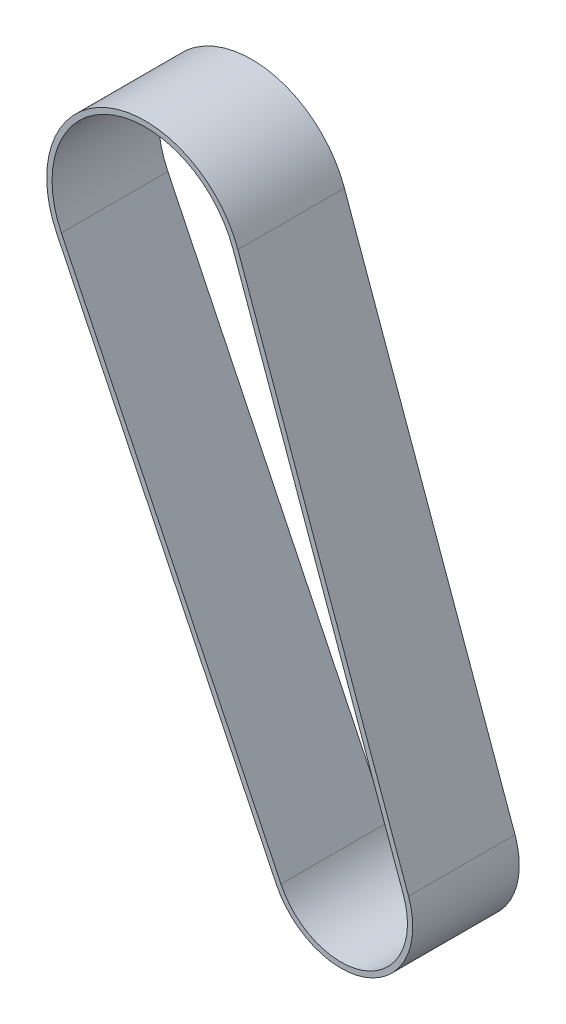
ISO-10303-21;
HEADER;
FILE_DESCRIPTION(('STEP AP214'),'2;1');
FILE_NAME('part.step','',(''),(''),'','','');
FILE_SCHEMA(('AUTOMOTIVE_DESIGN { 1 0 10303 214 1 1 1 1 }'));
ENDSEC;
DATA;
#1=APPLICATION_CONTEXT('core data for automotive mechanical design processes');
#2=APPLICATION_PROTOCOL_DEFINITION('international standard','automotive_design',2000,#1);
#3=PRODUCT_CONTEXT('',#1,'mechanical');
#4=PRODUCT('Part','Part','',(#3));
#5=PRODUCT_RELATED_PRODUCT_CATEGORY('part','',(#4));
#6=PRODUCT_DEFINITION_FORMATION('','',#4);
#7=PRODUCT_DEFINITION_CONTEXT('part definition',#1,'design');
#8=PRODUCT_DEFINITION('design','',#6,#7);
#9=PRODUCT_DEFINITION_SHAPE('','',#8);
#10=(LENGTH_UNIT() NAMED_UNIT(*) SI_UNIT(.MILLI.,.METRE.));
#11=(NAMED_UNIT(*) PLANE_ANGLE_UNIT() SI_UNIT($,.RADIAN.));
#12=(NAMED_UNIT(*) SI_UNIT($,.STERADIAN.) SOLID_ANGLE_UNIT());
#13=UNCERTAINTY_MEASURE_WITH_UNIT(LENGTH_MEASURE(1.E-05),#10,'distance_accuracy_value','');
#14=(GEOMETRIC_REPRESENTATION_CONTEXT(3) GLOBAL_UNCERTAINTY_ASSIGNED_CONTEXT((#13)) GLOBAL_UNIT_ASSIGNED_CONTEXT((#10,
#11,#12)) REPRESENTATION_CONTEXT('',''));
#15=CARTESIAN_POINT('',(0.,0.,0.));
#16=DIRECTION('',(0.,0.,1.));
#17=DIRECTION('',(1.,0.,0.));
#18=AXIS2_PLACEMENT_3D('',#15,#16,#17);
#19=CARTESIAN_POINT('',(0.,0.,20.));
#20=DIRECTION('',(0.,0.,1.));
#21=DIRECTION('',(1.,0.,0.));
#22=AXIS2_PLACEMENT_3D('',#19,#20,#21);
#23=PLANE('',#22);
#24=CARTESIAN_POINT('',(0.,0.,20.));
#25=DIRECTION('',(0.,0.,1.));
#26=DIRECTION('',(1.,0.,0.));
#27=AXIS2_PLACEMENT_3D('',#24,#25,#26);
#28=CIRCLE('',#27,18.5);
#29=CARTESIAN_POINT('',(17.4094753513145,6.25780856146702,20.));
#30=VERTEX_POINT('',#29);
#31=CARTESIAN_POINT('',(-16.6540418944766,-8.05561224097939,20.));
#32=VERTEX_POINT('',#31);
#33=EDGE_CURVE('E156',#30,#32,#28,.T.);
#34=ORIENTED_EDGE('',*,*,#33,.T.);
#35=DIRECTION('',(0.435438499512399,-0.900218480782522,0.));
#36=VECTOR('',#35,1.);
#37=CARTESIAN_POINT('',(-16.6540418944766,-8.05561224097939,20.));
#38=LINE('',#37,#36);
#39=CARTESIAN_POINT('',(24.5978673285744,-93.3391392872501,20.));
#40=VERTEX_POINT('',#39);
#41=EDGE_CURVE('E159',#32,#40,#38,.T.);
#42=ORIENTED_EDGE('',*,*,#41,.T.);
#43=CARTESIAN_POINT('',(36.7508168191384,-87.4607195438328,20.));
#44=DIRECTION('',(0.,0.,1.));
#45=DIRECTION('',(1.,0.,0.));
#46=AXIS2_PLACEMENT_3D('',#43,#44,#45);
#47=CIRCLE('',#46,13.5);
#48=CARTESIAN_POINT('',(49.4550285619896,-82.894210593573,20.));
#49=VERTEX_POINT('',#48);
#50=EDGE_CURVE('E162',#40,#49,#47,.T.);
#51=ORIENTED_EDGE('',*,*,#50,.T.);
#52=DIRECTION('',(-0.338259922241461,0.941052721692681,0.));
#53=VECTOR('',#52,1.);
#54=CARTESIAN_POINT('',(17.4094753513145,6.25780856146702,20.));
#55=LINE('',#54,#53);
#56=EDGE_CURVE('E164',#49,#30,#55,.T.);
#57=ORIENTED_EDGE('',*,*,#56,.T.);
#58=EDGE_LOOP('',(#34,#42,#51,#57));
#59=FACE_BOUND('',#58,.T.);
#60=DIRECTION('',(0.435438499512399,-0.900218480782522,0.));
#61=VECTOR('',#60,1.);
#62=CARTESIAN_POINT('',(-15.7538234136939,-7.62017374146703,20.));
#63=LINE('',#62,#61);
#64=CARTESIAN_POINT('',(-15.7538234136939,-7.62017374146703,20.));
#65=VERTEX_POINT('',#64);
#66=CARTESIAN_POINT('',(25.4980858093569,-92.9037007877378,20.));
#67=VERTEX_POINT('',#66);
#68=EDGE_CURVE('E128',#65,#67,#63,.T.);
#69=ORIENTED_EDGE('',*,*,#68,.F.);
#70=CARTESIAN_POINT('',(0.,0.,20.));
#71=DIRECTION('',(0.,0.,1.));
#72=DIRECTION('',(1.,0.,0.));
#73=AXIS2_PLACEMENT_3D('',#70,#71,#72);
#74=CIRCLE('',#73,17.5);
#75=CARTESIAN_POINT('',(16.4684226296221,5.91954863922556,20.));
#76=VERTEX_POINT('',#75);
#77=EDGE_CURVE('E120',#76,#65,#74,.T.);
#78=ORIENTED_EDGE('',*,*,#77,.F.);
#79=DIRECTION('',(-0.338259922241461,0.941052721692681,0.));
#80=VECTOR('',#79,1.);
#81=CARTESIAN_POINT('',(16.4684226296221,5.91954863922556,20.));
#82=LINE('',#81,#80);
#83=CARTESIAN_POINT('',(48.5139758402967,-83.2324705158145,20.));
#84=VERTEX_POINT('',#83);
#85=EDGE_CURVE('E142',#84,#76,#82,.T.);
#86=ORIENTED_EDGE('',*,*,#85,.F.);
#87=CARTESIAN_POINT('',(36.7508168191384,-87.4607195438328,20.));
#88=DIRECTION('',(0.,0.,1.));
#89=DIRECTION('',(1.,0.,0.));
#90=AXIS2_PLACEMENT_3D('',#87,#88,#89);
#91=CIRCLE('',#90,12.5);
#92=EDGE_CURVE('E140',#67,#84,#91,.T.);
#93=ORIENTED_EDGE('',*,*,#92,.F.);
#94=EDGE_LOOP('',(#69,#78,#86,#93));
#95=FACE_BOUND('',#94,.T.);
#96=ADVANCED_FACE('F55',(#59,#95),#23,.T.);
#97=CARTESIAN_POINT('',(0.,0.,0.));
#98=DIRECTION('',(0.,0.,1.));
#99=DIRECTION('',(1.,0.,0.));
#100=AXIS2_PLACEMENT_3D('',#97,#98,#99);
#101=PLANE('',#100);
#102=CARTESIAN_POINT('',(0.,0.,0.));
#103=DIRECTION('',(0.,0.,1.));
#104=DIRECTION('',(1.,0.,0.));
#105=AXIS2_PLACEMENT_3D('',#102,#103,#104);
#106=CIRCLE('',#105,18.5);
#107=CARTESIAN_POINT('',(17.4094753513145,6.25780856146702,0.));
#108=VERTEX_POINT('',#107);
#109=CARTESIAN_POINT('',(-16.6540418944766,-8.05561224097939,0.));
#110=VERTEX_POINT('',#109);
#111=EDGE_CURVE('E136',#108,#110,#106,.T.);
#112=ORIENTED_EDGE('',*,*,#111,.F.);
#113=DIRECTION('',(-0.338259922241461,0.941052721692681,0.));
#114=VECTOR('',#113,1.);
#115=CARTESIAN_POINT('',(17.4094753513145,6.25780856146702,0.));
#116=LINE('',#115,#114);
#117=CARTESIAN_POINT('',(49.4550285619896,-82.894210593573,0.));
#118=VERTEX_POINT('',#117);
#119=EDGE_CURVE('E160',#118,#108,#116,.T.);
#120=ORIENTED_EDGE('',*,*,#119,.F.);
#121=CARTESIAN_POINT('',(36.7508168191384,-87.4607195438328,0.));
#122=DIRECTION('',(0.,0.,1.));
#123=DIRECTION('',(1.,0.,0.));
#124=AXIS2_PLACEMENT_3D('',#121,#122,#123);
#125=CIRCLE('',#124,13.5);
#126=CARTESIAN_POINT('',(24.5978673285744,-93.3391392872501,0.));
#127=VERTEX_POINT('',#126);
#128=EDGE_CURVE('E171',#127,#118,#125,.T.);
#129=ORIENTED_EDGE('',*,*,#128,.F.);
#130=DIRECTION('',(0.435438499512399,-0.900218480782522,0.));
#131=VECTOR('',#130,1.);
#132=CARTESIAN_POINT('',(-16.6540418944766,-8.05561224097939,0.));
#133=LINE('',#132,#131);
#134=EDGE_CURVE('E169',#110,#127,#133,.T.);
#135=ORIENTED_EDGE('',*,*,#134,.F.);
#136=EDGE_LOOP('',(#112,#120,#129,#135));
#137=FACE_BOUND('',#136,.T.);
#138=CARTESIAN_POINT('',(0.,0.,0.));
#139=DIRECTION('',(0.,0.,1.));
#140=DIRECTION('',(1.,0.,0.));
#141=AXIS2_PLACEMENT_3D('',#138,#139,#140);
#142=CIRCLE('',#141,17.5);
#143=CARTESIAN_POINT('',(16.4684226296221,5.91954863922556,0.));
#144=VERTEX_POINT('',#143);
#145=CARTESIAN_POINT('',(-15.7538234136939,-7.62017374146703,0.));
#146=VERTEX_POINT('',#145);
#147=EDGE_CURVE('E78',#144,#146,#142,.T.);
#148=ORIENTED_EDGE('',*,*,#147,.T.);
#149=DIRECTION('',(0.435438499512399,-0.900218480782522,0.));
#150=VECTOR('',#149,1.);
#151=CARTESIAN_POINT('',(-15.7538234136939,-7.62017374146703,0.));
#152=LINE('',#151,#150);
#153=CARTESIAN_POINT('',(25.4980858093569,-92.9037007877378,0.));
#154=VERTEX_POINT('',#153);
#155=EDGE_CURVE('E135',#146,#154,#152,.T.);
#156=ORIENTED_EDGE('',*,*,#155,.T.);
#157=CARTESIAN_POINT('',(36.7508168191384,-87.4607195438328,0.));
#158=DIRECTION('',(0.,0.,1.));
#159=DIRECTION('',(1.,0.,0.));
#160=AXIS2_PLACEMENT_3D('',#157,#158,#159);
#161=CIRCLE('',#160,12.5);
#162=CARTESIAN_POINT('',(48.5139758402967,-83.2324705158145,0.));
#163=VERTEX_POINT('',#162);
#164=EDGE_CURVE('E148',#154,#163,#161,.T.);
#165=ORIENTED_EDGE('',*,*,#164,.T.);
#166=DIRECTION('',(-0.338259922241461,0.941052721692681,0.));
#167=VECTOR('',#166,1.);
#168=CARTESIAN_POINT('',(16.4684226296221,5.91954863922556,0.));
#169=LINE('',#168,#167);
#170=EDGE_CURVE('E129',#163,#144,#169,.T.);
#171=ORIENTED_EDGE('',*,*,#170,.T.);
#172=EDGE_LOOP('',(#148,#156,#165,#171));
#173=FACE_BOUND('',#172,.T.);
#174=ADVANCED_FACE('F189',(#137,#173),#101,.F.);
#175=CARTESIAN_POINT('',(0.,0.,20.));
#176=DIRECTION('',(0.,0.,-1.));
#177=DIRECTION('',(-1.,0.,0.));
#178=AXIS2_PLACEMENT_3D('',#175,#176,#177);
#179=CYLINDRICAL_SURFACE('',#178,18.5);
#180=ORIENTED_EDGE('',*,*,#111,.T.);
#181=DIRECTION('',(0.,0.,-1.));
#182=VECTOR('',#181,1.);
#183=CARTESIAN_POINT('',(-16.6540418944766,-8.05561224097939,20.));
#184=LINE('',#183,#182);
#185=EDGE_CURVE('E12',#32,#110,#184,.T.);
#186=ORIENTED_EDGE('',*,*,#185,.F.);
#187=ORIENTED_EDGE('',*,*,#33,.F.);
#188=DIRECTION('',(0.,0.,-1.));
#189=VECTOR('',#188,1.);
#190=CARTESIAN_POINT('',(17.4094753513145,6.25780856146702,20.));
#191=LINE('',#190,#189);
#192=EDGE_CURVE('E166',#30,#108,#191,.T.);
#193=ORIENTED_EDGE('',*,*,#192,.T.);
#194=EDGE_LOOP('',(#180,#186,#187,#193));
#195=FACE_BOUND('',#194,.T.);
#196=ADVANCED_FACE('F57',(#195),#179,.T.);
#197=CARTESIAN_POINT('',(-16.6540418944766,-8.05561224097939,20.));
#198=DIRECTION('',(0.900218480782522,0.435438499512399,0.));
#199=DIRECTION('',(-0.435438499512399,0.900218480782522,0.));
#200=AXIS2_PLACEMENT_3D('',#197,#198,#199);
#201=PLANE('',#200);
#202=ORIENTED_EDGE('',*,*,#134,.T.);
#203=DIRECTION('',(0.,0.,-1.));
#204=VECTOR('',#203,1.);
#205=CARTESIAN_POINT('',(24.5978673285744,-93.3391392872501,20.));
#206=LINE('',#205,#204);
#207=EDGE_CURVE('E63',#40,#127,#206,.T.);
#208=ORIENTED_EDGE('',*,*,#207,.F.);
#209=ORIENTED_EDGE('',*,*,#41,.F.);
#210=ORIENTED_EDGE('',*,*,#185,.T.);
#211=EDGE_LOOP('',(#202,#208,#209,#210));
#212=FACE_BOUND('',#211,.T.);
#213=ADVANCED_FACE('F199',(#212),#201,.F.);
#214=CARTESIAN_POINT('',(36.7508168191384,-87.4607195438328,20.));
#215=DIRECTION('',(0.,0.,-1.));
#216=DIRECTION('',(-1.,0.,0.));
#217=AXIS2_PLACEMENT_3D('',#214,#215,#216);
#218=CYLINDRICAL_SURFACE('',#217,13.5);
#219=ORIENTED_EDGE('',*,*,#128,.T.);
#220=DIRECTION('',(0.,0.,-1.));
#221=VECTOR('',#220,1.);
#222=CARTESIAN_POINT('',(49.4550285619896,-82.894210593573,20.));
#223=LINE('',#222,#221);
#224=EDGE_CURVE('E176',#49,#118,#223,.T.);
#225=ORIENTED_EDGE('',*,*,#224,.F.);
#226=ORIENTED_EDGE('',*,*,#50,.F.);
#227=ORIENTED_EDGE('',*,*,#207,.T.);
#228=EDGE_LOOP('',(#219,#225,#226,#227));
#229=FACE_BOUND('',#228,.T.);
#230=ADVANCED_FACE('F183',(#229),#218,.T.);
#231=CARTESIAN_POINT('',(17.4094753513145,6.25780856146702,20.));
#232=DIRECTION('',(-0.941052721692681,-0.338259922241461,0.));
#233=DIRECTION('',(0.338259922241461,-0.941052721692681,0.));
#234=AXIS2_PLACEMENT_3D('',#231,#232,#233);
#235=PLANE('',#234);
#236=ORIENTED_EDGE('',*,*,#119,.T.);
#237=ORIENTED_EDGE('',*,*,#192,.F.);
#238=ORIENTED_EDGE('',*,*,#56,.F.);
#239=ORIENTED_EDGE('',*,*,#224,.T.);
#240=EDGE_LOOP('',(#236,#237,#238,#239));
#241=FACE_BOUND('',#240,.T.);
#242=ADVANCED_FACE('F193',(#241),#235,.F.);
#243=CARTESIAN_POINT('',(0.,0.,20.));
#244=DIRECTION('',(0.,0.,-1.));
#245=DIRECTION('',(-1.,0.,0.));
#246=AXIS2_PLACEMENT_3D('',#243,#244,#245);
#247=CYLINDRICAL_SURFACE('',#246,17.5);
#248=ORIENTED_EDGE('',*,*,#147,.F.);
#249=DIRECTION('',(0.,0.,-1.));
#250=VECTOR('',#249,1.);
#251=CARTESIAN_POINT('',(16.4684226296221,5.91954863922556,20.));
#252=LINE('',#251,#250);
#253=EDGE_CURVE('E124',#76,#144,#252,.T.);
#254=ORIENTED_EDGE('',*,*,#253,.F.);
#255=ORIENTED_EDGE('',*,*,#77,.T.);
#256=DIRECTION('',(0.,0.,-1.));
#257=VECTOR('',#256,1.);
#258=CARTESIAN_POINT('',(-15.7538234136939,-7.62017374146703,20.));
#259=LINE('',#258,#257);
#260=EDGE_CURVE('E123',#65,#146,#259,.T.);
#261=ORIENTED_EDGE('',*,*,#260,.T.);
#262=EDGE_LOOP('',(#248,#254,#255,#261));
#263=FACE_BOUND('',#262,.T.);
#264=ADVANCED_FACE('F122',(#263),#247,.F.);
#265=CARTESIAN_POINT('',(-15.7538234136939,-7.62017374146703,20.));
#266=DIRECTION('',(0.900218480782522,0.435438499512399,0.));
#267=DIRECTION('',(-0.435438499512399,0.900218480782522,0.));
#268=AXIS2_PLACEMENT_3D('',#265,#266,#267);
#269=PLANE('',#268);
#270=ORIENTED_EDGE('',*,*,#155,.F.);
#271=ORIENTED_EDGE('',*,*,#260,.F.);
#272=ORIENTED_EDGE('',*,*,#68,.T.);
#273=DIRECTION('',(0.,0.,-1.));
#274=VECTOR('',#273,1.);
#275=CARTESIAN_POINT('',(25.4980858093569,-92.9037007877378,20.));
#276=LINE('',#275,#274);
#277=EDGE_CURVE('E137',#67,#154,#276,.T.);
#278=ORIENTED_EDGE('',*,*,#277,.T.);
#279=EDGE_LOOP('',(#270,#271,#272,#278));
#280=FACE_BOUND('',#279,.T.);
#281=ADVANCED_FACE('F132',(#280),#269,.T.);
#282=CARTESIAN_POINT('',(36.7508168191384,-87.4607195438328,20.));
#283=DIRECTION('',(0.,0.,-1.));
#284=DIRECTION('',(-1.,0.,0.));
#285=AXIS2_PLACEMENT_3D('',#282,#283,#284);
#286=CYLINDRICAL_SURFACE('',#285,12.5);
#287=ORIENTED_EDGE('',*,*,#164,.F.);
#288=ORIENTED_EDGE('',*,*,#277,.F.);
#289=ORIENTED_EDGE('',*,*,#92,.T.);
#290=DIRECTION('',(0.,0.,-1.));
#291=VECTOR('',#290,1.);
#292=CARTESIAN_POINT('',(48.5139758402967,-83.2324705158145,20.));
#293=LINE('',#292,#291);
#294=EDGE_CURVE('E70',#84,#163,#293,.T.);
#295=ORIENTED_EDGE('',*,*,#294,.T.);
#296=EDGE_LOOP('',(#287,#288,#289,#295));
#297=FACE_BOUND('',#296,.T.);
#298=ADVANCED_FACE('F222',(#297),#286,.F.);
#299=CARTESIAN_POINT('',(16.4684226296221,5.91954863922556,20.));
#300=DIRECTION('',(-0.941052721692681,-0.338259922241461,0.));
#301=DIRECTION('',(0.338259922241461,-0.941052721692681,0.));
#302=AXIS2_PLACEMENT_3D('',#299,#300,#301);
#303=PLANE('',#302);
#304=ORIENTED_EDGE('',*,*,#170,.F.);
#305=ORIENTED_EDGE('',*,*,#294,.F.);
#306=ORIENTED_EDGE('',*,*,#85,.T.);
#307=ORIENTED_EDGE('',*,*,#253,.T.);
#308=EDGE_LOOP('',(#304,#305,#306,#307));
#309=FACE_BOUND('',#308,.T.);
#310=ADVANCED_FACE('F226',(#309),#303,.T.);
#311=CLOSED_SHELL('',(#96,#174,#196,#213,#230,#242,#264,#281,#298,#310));
#312=MANIFOLD_SOLID_BREP('B2',#311);
#313=ADVANCED_BREP_SHAPE_REPRESENTATION('',(#18,#312),#14);
#314=SHAPE_DEFINITION_REPRESENTATION(#9,#313);
ENDSEC;
END-ISO-10303-21;
